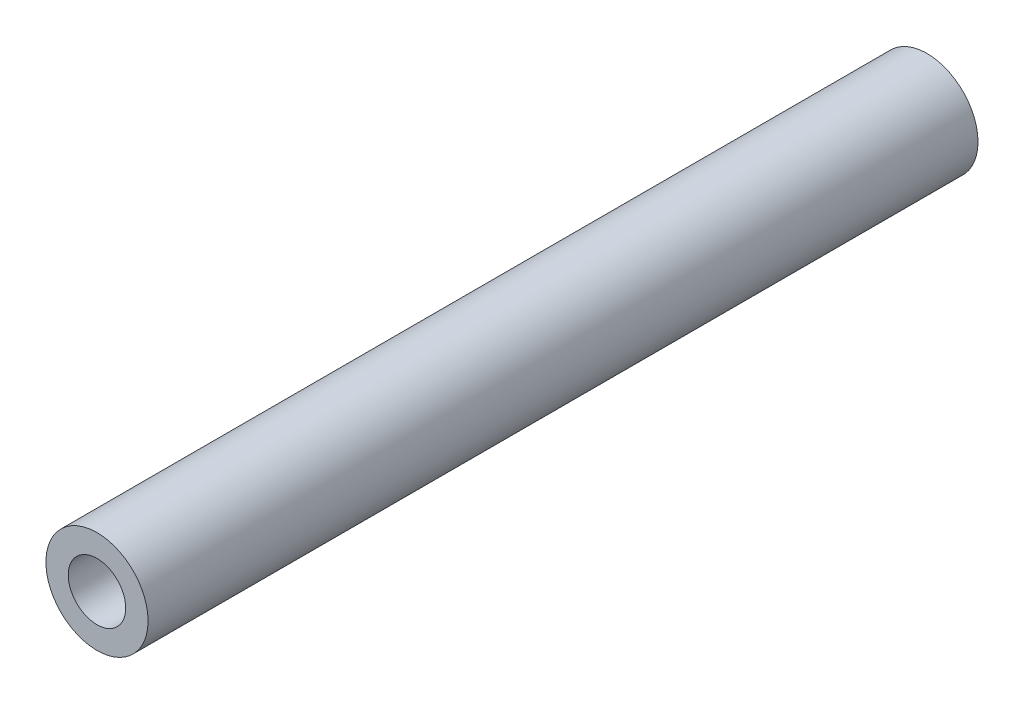
ISO-10303-21;
HEADER;
FILE_DESCRIPTION(('STEP AP214'),'2;1');
FILE_NAME('part.step','',(''),(''),'','','');
FILE_SCHEMA(('AUTOMOTIVE_DESIGN { 1 0 10303 214 1 1 1 1 }'));
ENDSEC;
DATA;
#1=APPLICATION_CONTEXT('core data for automotive mechanical design processes');
#2=APPLICATION_PROTOCOL_DEFINITION('international standard','automotive_design',2000,#1);
#3=PRODUCT_CONTEXT('',#1,'mechanical');
#4=PRODUCT('Part','Part','',(#3));
#5=PRODUCT_RELATED_PRODUCT_CATEGORY('part','',(#4));
#6=PRODUCT_DEFINITION_FORMATION('','',#4);
#7=PRODUCT_DEFINITION_CONTEXT('part definition',#1,'design');
#8=PRODUCT_DEFINITION('design','',#6,#7);
#9=PRODUCT_DEFINITION_SHAPE('','',#8);
#10=(LENGTH_UNIT() NAMED_UNIT(*) SI_UNIT(.MILLI.,.METRE.));
#11=(NAMED_UNIT(*) PLANE_ANGLE_UNIT() SI_UNIT($,.RADIAN.));
#12=(NAMED_UNIT(*) SI_UNIT($,.STERADIAN.) SOLID_ANGLE_UNIT());
#13=UNCERTAINTY_MEASURE_WITH_UNIT(LENGTH_MEASURE(1.E-05),#10,'distance_accuracy_value','');
#14=(GEOMETRIC_REPRESENTATION_CONTEXT(3) GLOBAL_UNCERTAINTY_ASSIGNED_CONTEXT((#13)) GLOBAL_UNIT_ASSIGNED_CONTEXT((#10,
#11,#12)) REPRESENTATION_CONTEXT('',''));
#15=CARTESIAN_POINT('',(0.,0.,0.));
#16=DIRECTION('',(0.,0.,1.));
#17=DIRECTION('',(1.,0.,0.));
#18=AXIS2_PLACEMENT_3D('',#15,#16,#17);
#19=CARTESIAN_POINT('',(0.,0.,33.));
#20=DIRECTION('',(0.,0.,1.));
#21=DIRECTION('',(1.,0.,0.));
#22=AXIS2_PLACEMENT_3D('',#19,#20,#21);
#23=PLANE('',#22);
#24=CARTESIAN_POINT('',(0.,0.,33.));
#25=DIRECTION('',(0.,0.,1.));
#26=DIRECTION('',(1.,0.,0.));
#27=AXIS2_PLACEMENT_3D('',#24,#25,#26);
#28=CIRCLE('',#27,4.);
#29=CARTESIAN_POINT('',(4.,0.,33.));
#30=VERTEX_POINT('',#29);
#31=EDGE_CURVE('E10',#30,#30,#28,.T.);
#32=ORIENTED_EDGE('',*,*,#31,.T.);
#33=EDGE_LOOP('',(#32));
#34=FACE_BOUND('',#33,.T.);
#35=CARTESIAN_POINT('',(0.,0.,33.));
#36=DIRECTION('',(0.,0.,1.));
#37=DIRECTION('',(1.,0.,0.));
#38=AXIS2_PLACEMENT_3D('',#35,#36,#37);
#39=CIRCLE('',#38,2.25);
#40=CARTESIAN_POINT('',(2.25,0.,33.));
#41=VERTEX_POINT('',#40);
#42=EDGE_CURVE('E50',#41,#41,#39,.T.);
#43=ORIENTED_EDGE('',*,*,#42,.F.);
#44=EDGE_LOOP('',(#43));
#45=FACE_BOUND('',#44,.T.);
#46=ADVANCED_FACE('F36',(#34,#45),#23,.T.);
#47=CARTESIAN_POINT('',(0.,0.,-32.));
#48=DIRECTION('',(0.,0.,1.));
#49=DIRECTION('',(1.,0.,0.));
#50=AXIS2_PLACEMENT_3D('',#47,#48,#49);
#51=PLANE('',#50);
#52=CARTESIAN_POINT('',(0.,0.,-32.));
#53=DIRECTION('',(0.,0.,1.));
#54=DIRECTION('',(1.,0.,0.));
#55=AXIS2_PLACEMENT_3D('',#52,#53,#54);
#56=CIRCLE('',#55,4.);
#57=CARTESIAN_POINT('',(4.,0.,-32.));
#58=VERTEX_POINT('',#57);
#59=EDGE_CURVE('E40',#58,#58,#56,.T.);
#60=ORIENTED_EDGE('',*,*,#59,.F.);
#61=EDGE_LOOP('',(#60));
#62=FACE_BOUND('',#61,.T.);
#63=CARTESIAN_POINT('',(0.,0.,-32.));
#64=DIRECTION('',(0.,0.,1.));
#65=DIRECTION('',(1.,0.,0.));
#66=AXIS2_PLACEMENT_3D('',#63,#64,#65);
#67=CIRCLE('',#66,2.25);
#68=CARTESIAN_POINT('',(2.25,0.,-32.));
#69=VERTEX_POINT('',#68);
#70=EDGE_CURVE('E52',#69,#69,#67,.T.);
#71=ORIENTED_EDGE('',*,*,#70,.T.);
#72=EDGE_LOOP('',(#71));
#73=FACE_BOUND('',#72,.T.);
#74=ADVANCED_FACE('F63',(#62,#73),#51,.F.);
#75=CARTESIAN_POINT('',(0.,0.,33.));
#76=DIRECTION('',(0.,0.,-1.));
#77=DIRECTION('',(-1.,0.,0.));
#78=AXIS2_PLACEMENT_3D('',#75,#76,#77);
#79=CYLINDRICAL_SURFACE('',#78,4.);
#80=ORIENTED_EDGE('',*,*,#31,.F.);
#81=EDGE_LOOP('',(#80));
#82=FACE_BOUND('',#81,.T.);
#83=ORIENTED_EDGE('',*,*,#59,.T.);
#84=EDGE_LOOP('',(#83));
#85=FACE_BOUND('',#84,.T.);
#86=ADVANCED_FACE('F38',(#82,#85),#79,.T.);
#87=CARTESIAN_POINT('',(0.,0.,33.));
#88=DIRECTION('',(0.,0.,-1.));
#89=DIRECTION('',(-1.,0.,0.));
#90=AXIS2_PLACEMENT_3D('',#87,#88,#89);
#91=CYLINDRICAL_SURFACE('',#90,2.25);
#92=ORIENTED_EDGE('',*,*,#42,.T.);
#93=EDGE_LOOP('',(#92));
#94=FACE_BOUND('',#93,.T.);
#95=ORIENTED_EDGE('',*,*,#70,.F.);
#96=EDGE_LOOP('',(#95));
#97=FACE_BOUND('',#96,.T.);
#98=ADVANCED_FACE('F59',(#94,#97),#91,.F.);
#99=CLOSED_SHELL('',(#46,#74,#86,#98));
#100=MANIFOLD_SOLID_BREP('B2',#99);
#101=ADVANCED_BREP_SHAPE_REPRESENTATION('',(#18,#100),#14);
#102=SHAPE_DEFINITION_REPRESENTATION(#9,#101);
ENDSEC;
END-ISO-10303-21;
